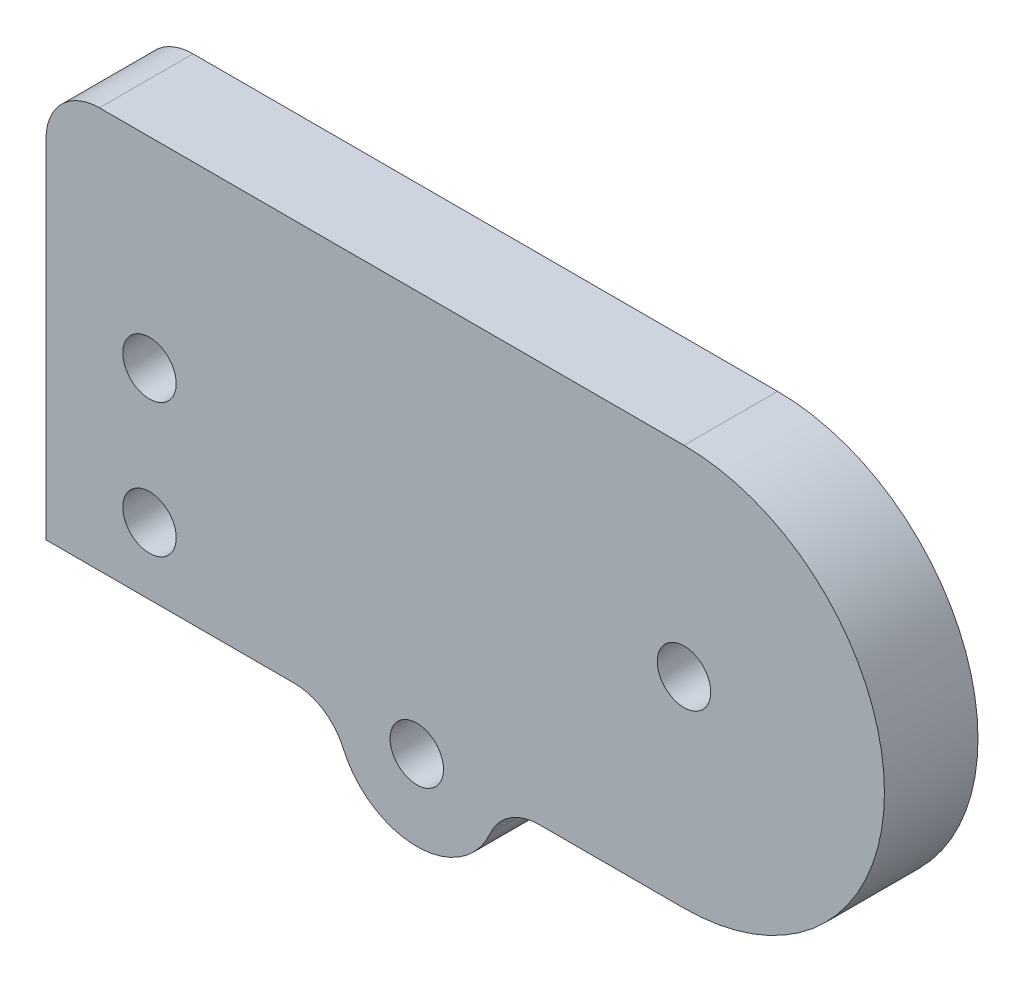
ISO-10303-21;
HEADER;
FILE_DESCRIPTION(('STEP AP214'),'2;1');
FILE_NAME('part.step','',(''),(''),'','','');
FILE_SCHEMA(('AUTOMOTIVE_DESIGN { 1 0 10303 214 1 1 1 1 }'));
ENDSEC;
DATA;
#1=APPLICATION_CONTEXT('core data for automotive mechanical design processes');
#2=APPLICATION_PROTOCOL_DEFINITION('international standard','automotive_design',2000,#1);
#3=PRODUCT_CONTEXT('',#1,'mechanical');
#4=PRODUCT('Part','Part','',(#3));
#5=PRODUCT_RELATED_PRODUCT_CATEGORY('part','',(#4));
#6=PRODUCT_DEFINITION_FORMATION('','',#4);
#7=PRODUCT_DEFINITION_CONTEXT('part definition',#1,'design');
#8=PRODUCT_DEFINITION('design','',#6,#7);
#9=PRODUCT_DEFINITION_SHAPE('','',#8);
#10=(LENGTH_UNIT() NAMED_UNIT(*) SI_UNIT(.MILLI.,.METRE.));
#11=(NAMED_UNIT(*) PLANE_ANGLE_UNIT() SI_UNIT($,.RADIAN.));
#12=(NAMED_UNIT(*) SI_UNIT($,.STERADIAN.) SOLID_ANGLE_UNIT());
#13=UNCERTAINTY_MEASURE_WITH_UNIT(LENGTH_MEASURE(1.E-05),#10,'distance_accuracy_value','');
#14=(GEOMETRIC_REPRESENTATION_CONTEXT(3) GLOBAL_UNCERTAINTY_ASSIGNED_CONTEXT((#13)) GLOBAL_UNIT_ASSIGNED_CONTEXT((#10,
#11,#12)) REPRESENTATION_CONTEXT('',''));
#15=CARTESIAN_POINT('',(0.,0.,0.));
#16=DIRECTION('',(0.,0.,1.));
#17=DIRECTION('',(1.,0.,0.));
#18=AXIS2_PLACEMENT_3D('',#15,#16,#17);
#19=CARTESIAN_POINT('',(2.,13.,3.5));
#20=DIRECTION('',(0.,0.,-1.));
#21=DIRECTION('',(-1.,0.,0.));
#22=AXIS2_PLACEMENT_3D('',#19,#20,#21);
#23=PLANE('',#22);
#24=DIRECTION('',(1.,0.,0.));
#25=VECTOR('',#24,1.);
#26=CARTESIAN_POINT('',(9.29040765125158,0.,3.5));
#27=LINE('',#26,#25);
#28=CARTESIAN_POINT('',(0.,0.,3.5));
#29=VERTEX_POINT('',#28);
#30=CARTESIAN_POINT('',(9.29040765125158,0.,3.5));
#31=VERTEX_POINT('',#30);
#32=EDGE_CURVE('E152',#29,#31,#27,.T.);
#33=ORIENTED_EDGE('',*,*,#32,.T.);
#34=CARTESIAN_POINT('',(9.29040765125158,-2.,3.5));
#35=DIRECTION('',(0.,0.,-1.));
#36=DIRECTION('',(1.,0.,0.));
#37=AXIS2_PLACEMENT_3D('',#34,#35,#36);
#38=CIRCLE('',#37,2.);
#39=CARTESIAN_POINT('',(11.1234379292339,-1.2,3.5));
#40=VERTEX_POINT('',#39);
#41=EDGE_CURVE('E95',#31,#40,#38,.T.);
#42=ORIENTED_EDGE('',*,*,#41,.T.);
#43=CARTESIAN_POINT('',(13.8729833462074,0.,3.5));
#44=DIRECTION('',(0.,0.,1.));
#45=DIRECTION('',(-1.,0.,0.));
#46=AXIS2_PLACEMENT_3D('',#43,#44,#45);
#47=CIRCLE('',#46,3.);
#48=CARTESIAN_POINT('',(16.6225287631809,-1.2,3.5));
#49=VERTEX_POINT('',#48);
#50=EDGE_CURVE('E170',#40,#49,#47,.T.);
#51=ORIENTED_EDGE('',*,*,#50,.T.);
#52=CARTESIAN_POINT('',(18.4555590411633,-2.,3.5));
#53=DIRECTION('',(0.,0.,-1.));
#54=DIRECTION('',(1.,0.,0.));
#55=AXIS2_PLACEMENT_3D('',#52,#53,#54);
#56=CIRCLE('',#55,2.);
#57=CARTESIAN_POINT('',(18.4555590411633,0.,3.5));
#58=VERTEX_POINT('',#57);
#59=EDGE_CURVE('E187',#49,#58,#56,.T.);
#60=ORIENTED_EDGE('',*,*,#59,.T.);
#61=DIRECTION('',(1.,0.,0.));
#62=VECTOR('',#61,1.);
#63=CARTESIAN_POINT('',(23.8729833462074,0.,3.5));
#64=LINE('',#63,#62);
#65=CARTESIAN_POINT('',(23.8729833462074,0.,3.5));
#66=VERTEX_POINT('',#65);
#67=EDGE_CURVE('E186',#58,#66,#64,.T.);
#68=ORIENTED_EDGE('',*,*,#67,.T.);
#69=CARTESIAN_POINT('',(23.8729833462074,7.5,3.5));
#70=DIRECTION('',(0.,0.,1.));
#71=DIRECTION('',(-1.,0.,0.));
#72=AXIS2_PLACEMENT_3D('',#69,#70,#71);
#73=CIRCLE('',#72,7.5);
#74=CARTESIAN_POINT('',(23.8729833462074,15.,3.5));
#75=VERTEX_POINT('',#74);
#76=EDGE_CURVE('E117',#66,#75,#73,.T.);
#77=ORIENTED_EDGE('',*,*,#76,.T.);
#78=DIRECTION('',(-1.,0.,0.));
#79=VECTOR('',#78,1.);
#80=CARTESIAN_POINT('',(2.00000000000001,15.,3.5));
#81=LINE('',#80,#79);
#82=CARTESIAN_POINT('',(2.00000000000001,15.,3.5));
#83=VERTEX_POINT('',#82);
#84=EDGE_CURVE('E111',#75,#83,#81,.T.);
#85=ORIENTED_EDGE('',*,*,#84,.T.);
#86=CARTESIAN_POINT('',(2.,13.,3.5));
#87=DIRECTION('',(0.,0.,1.));
#88=DIRECTION('',(-1.,0.,0.));
#89=AXIS2_PLACEMENT_3D('',#86,#87,#88);
#90=CIRCLE('',#89,2.);
#91=CARTESIAN_POINT('',(0.,13.,3.5));
#92=VERTEX_POINT('',#91);
#93=EDGE_CURVE('E115',#83,#92,#90,.T.);
#94=ORIENTED_EDGE('',*,*,#93,.T.);
#95=DIRECTION('',(0.,-1.,0.));
#96=VECTOR('',#95,1.);
#97=CARTESIAN_POINT('',(0.,0.,3.5));
#98=LINE('',#97,#96);
#99=EDGE_CURVE('E49',#92,#29,#98,.T.);
#100=ORIENTED_EDGE('',*,*,#99,.T.);
#101=EDGE_LOOP('',(#33,#42,#51,#60,#68,#77,#85,#94,#100));
#102=FACE_BOUND('',#101,.T.);
#103=CARTESIAN_POINT('',(3.87298334620742,7.5,3.5));
#104=DIRECTION('',(0.,0.,1.));
#105=DIRECTION('',(1.,0.,0.));
#106=AXIS2_PLACEMENT_3D('',#103,#104,#105);
#107=CIRCLE('',#106,0.999999999999999);
#108=CARTESIAN_POINT('',(4.87298334620742,7.5,3.5));
#109=VERTEX_POINT('',#108);
#110=EDGE_CURVE('E139',#109,#109,#107,.T.);
#111=ORIENTED_EDGE('',*,*,#110,.F.);
#112=EDGE_LOOP('',(#111));
#113=FACE_BOUND('',#112,.T.);
#114=CARTESIAN_POINT('',(23.8729833462074,7.5,3.5));
#115=DIRECTION('',(0.,0.,1.));
#116=DIRECTION('',(1.,0.,0.));
#117=AXIS2_PLACEMENT_3D('',#114,#115,#116);
#118=CIRCLE('',#117,1.);
#119=CARTESIAN_POINT('',(24.8729833462074,7.5,3.5));
#120=VERTEX_POINT('',#119);
#121=EDGE_CURVE('E197',#120,#120,#118,.T.);
#122=ORIENTED_EDGE('',*,*,#121,.F.);
#123=EDGE_LOOP('',(#122));
#124=FACE_BOUND('',#123,.T.);
#125=CARTESIAN_POINT('',(13.8729833462074,0.,3.5));
#126=DIRECTION('',(0.,0.,1.));
#127=DIRECTION('',(1.,0.,0.));
#128=AXIS2_PLACEMENT_3D('',#125,#126,#127);
#129=CIRCLE('',#128,1.);
#130=CARTESIAN_POINT('',(14.8729833462074,0.,3.5));
#131=VERTEX_POINT('',#130);
#132=EDGE_CURVE('E203',#131,#131,#129,.T.);
#133=ORIENTED_EDGE('',*,*,#132,.F.);
#134=EDGE_LOOP('',(#133));
#135=FACE_BOUND('',#134,.T.);
#136=CARTESIAN_POINT('',(3.87298334620742,2.5,3.5));
#137=DIRECTION('',(0.,0.,1.));
#138=DIRECTION('',(1.,0.,0.));
#139=AXIS2_PLACEMENT_3D('',#136,#137,#138);
#140=CIRCLE('',#139,1.);
#141=CARTESIAN_POINT('',(4.87298334620742,2.5,3.5));
#142=VERTEX_POINT('',#141);
#143=EDGE_CURVE('E209',#142,#142,#140,.T.);
#144=ORIENTED_EDGE('',*,*,#143,.F.);
#145=EDGE_LOOP('',(#144));
#146=FACE_BOUND('',#145,.T.);
#147=ADVANCED_FACE('F32',(#102,#113,#124,#135,#146),#23,.F.);
#148=CARTESIAN_POINT('',(2.,13.,0.));
#149=DIRECTION('',(0.,0.,-1.));
#150=DIRECTION('',(-1.,0.,0.));
#151=AXIS2_PLACEMENT_3D('',#148,#149,#150);
#152=PLANE('',#151);
#153=CARTESIAN_POINT('',(13.8729833462074,0.,0.));
#154=DIRECTION('',(0.,0.,1.));
#155=DIRECTION('',(1.,0.,0.));
#156=AXIS2_PLACEMENT_3D('',#153,#154,#155);
#157=CIRCLE('',#156,1.);
#158=CARTESIAN_POINT('',(14.8729833462074,0.,0.));
#159=VERTEX_POINT('',#158);
#160=EDGE_CURVE('E206',#159,#159,#157,.T.);
#161=ORIENTED_EDGE('',*,*,#160,.T.);
#162=EDGE_LOOP('',(#161));
#163=FACE_BOUND('',#162,.T.);
#164=CARTESIAN_POINT('',(3.87298334620742,7.5,0.));
#165=DIRECTION('',(0.,0.,1.));
#166=DIRECTION('',(1.,0.,0.));
#167=AXIS2_PLACEMENT_3D('',#164,#165,#166);
#168=CIRCLE('',#167,0.999999999999999);
#169=CARTESIAN_POINT('',(4.87298334620742,7.5,0.));
#170=VERTEX_POINT('',#169);
#171=EDGE_CURVE('E194',#170,#170,#168,.T.);
#172=ORIENTED_EDGE('',*,*,#171,.T.);
#173=EDGE_LOOP('',(#172));
#174=FACE_BOUND('',#173,.T.);
#175=DIRECTION('',(1.,0.,0.));
#176=VECTOR('',#175,1.);
#177=CARTESIAN_POINT('',(9.29040765125158,0.,0.));
#178=LINE('',#177,#176);
#179=CARTESIAN_POINT('',(0.,0.,0.));
#180=VERTEX_POINT('',#179);
#181=CARTESIAN_POINT('',(9.29040765125158,0.,0.));
#182=VERTEX_POINT('',#181);
#183=EDGE_CURVE('E135',#180,#182,#178,.T.);
#184=ORIENTED_EDGE('',*,*,#183,.F.);
#185=DIRECTION('',(0.,-1.,0.));
#186=VECTOR('',#185,1.);
#187=CARTESIAN_POINT('',(0.,0.,0.));
#188=LINE('',#187,#186);
#189=CARTESIAN_POINT('',(0.,13.,0.));
#190=VERTEX_POINT('',#189);
#191=EDGE_CURVE('E87',#190,#180,#188,.T.);
#192=ORIENTED_EDGE('',*,*,#191,.F.);
#193=CARTESIAN_POINT('',(2.,13.,0.));
#194=DIRECTION('',(0.,0.,1.));
#195=DIRECTION('',(-1.,0.,0.));
#196=AXIS2_PLACEMENT_3D('',#193,#194,#195);
#197=CIRCLE('',#196,2.);
#198=CARTESIAN_POINT('',(2.00000000000001,15.,0.));
#199=VERTEX_POINT('',#198);
#200=EDGE_CURVE('E81',#199,#190,#197,.T.);
#201=ORIENTED_EDGE('',*,*,#200,.F.);
#202=DIRECTION('',(-1.,0.,0.));
#203=VECTOR('',#202,1.);
#204=CARTESIAN_POINT('',(2.00000000000001,15.,0.));
#205=LINE('',#204,#203);
#206=CARTESIAN_POINT('',(23.8729833462074,15.,0.));
#207=VERTEX_POINT('',#206);
#208=EDGE_CURVE('E125',#207,#199,#205,.T.);
#209=ORIENTED_EDGE('',*,*,#208,.F.);
#210=CARTESIAN_POINT('',(23.8729833462074,7.5,0.));
#211=DIRECTION('',(0.,0.,1.));
#212=DIRECTION('',(-1.,0.,0.));
#213=AXIS2_PLACEMENT_3D('',#210,#211,#212);
#214=CIRCLE('',#213,7.5);
#215=CARTESIAN_POINT('',(23.8729833462074,0.,0.));
#216=VERTEX_POINT('',#215);
#217=EDGE_CURVE('E147',#216,#207,#214,.T.);
#218=ORIENTED_EDGE('',*,*,#217,.F.);
#219=DIRECTION('',(1.,0.,0.));
#220=VECTOR('',#219,1.);
#221=CARTESIAN_POINT('',(23.8729833462074,0.,0.));
#222=LINE('',#221,#220);
#223=CARTESIAN_POINT('',(18.4555590411633,0.,0.));
#224=VERTEX_POINT('',#223);
#225=EDGE_CURVE('E145',#224,#216,#222,.T.);
#226=ORIENTED_EDGE('',*,*,#225,.F.);
#227=CARTESIAN_POINT('',(18.4555590411633,-2.,0.));
#228=DIRECTION('',(0.,0.,-1.));
#229=DIRECTION('',(1.,0.,0.));
#230=AXIS2_PLACEMENT_3D('',#227,#228,#229);
#231=CIRCLE('',#230,2.);
#232=CARTESIAN_POINT('',(16.6225287631809,-1.2,0.));
#233=VERTEX_POINT('',#232);
#234=EDGE_CURVE('E143',#233,#224,#231,.T.);
#235=ORIENTED_EDGE('',*,*,#234,.F.);
#236=CARTESIAN_POINT('',(13.8729833462074,0.,0.));
#237=DIRECTION('',(0.,0.,1.));
#238=DIRECTION('',(-1.,0.,0.));
#239=AXIS2_PLACEMENT_3D('',#236,#237,#238);
#240=CIRCLE('',#239,3.);
#241=CARTESIAN_POINT('',(11.1234379292339,-1.2,0.));
#242=VERTEX_POINT('',#241);
#243=EDGE_CURVE('E141',#242,#233,#240,.T.);
#244=ORIENTED_EDGE('',*,*,#243,.F.);
#245=CARTESIAN_POINT('',(9.29040765125158,-2.,0.));
#246=DIRECTION('',(0.,0.,-1.));
#247=DIRECTION('',(1.,0.,0.));
#248=AXIS2_PLACEMENT_3D('',#245,#246,#247);
#249=CIRCLE('',#248,2.);
#250=EDGE_CURVE('E138',#182,#242,#249,.T.);
#251=ORIENTED_EDGE('',*,*,#250,.F.);
#252=EDGE_LOOP('',(#184,#192,#201,#209,#218,#226,#235,#244,#251));
#253=FACE_BOUND('',#252,.T.);
#254=CARTESIAN_POINT('',(23.8729833462074,7.5,0.));
#255=DIRECTION('',(0.,0.,1.));
#256=DIRECTION('',(1.,0.,0.));
#257=AXIS2_PLACEMENT_3D('',#254,#255,#256);
#258=CIRCLE('',#257,1.);
#259=CARTESIAN_POINT('',(24.8729833462074,7.5,0.));
#260=VERTEX_POINT('',#259);
#261=EDGE_CURVE('E200',#260,#260,#258,.T.);
#262=ORIENTED_EDGE('',*,*,#261,.T.);
#263=EDGE_LOOP('',(#262));
#264=FACE_BOUND('',#263,.T.);
#265=CARTESIAN_POINT('',(3.87298334620742,2.5,0.));
#266=DIRECTION('',(0.,0.,1.));
#267=DIRECTION('',(1.,0.,0.));
#268=AXIS2_PLACEMENT_3D('',#265,#266,#267);
#269=CIRCLE('',#268,1.);
#270=CARTESIAN_POINT('',(4.87298334620742,2.5,0.));
#271=VERTEX_POINT('',#270);
#272=EDGE_CURVE('E212',#271,#271,#269,.T.);
#273=ORIENTED_EDGE('',*,*,#272,.T.);
#274=EDGE_LOOP('',(#273));
#275=FACE_BOUND('',#274,.T.);
#276=ADVANCED_FACE('F174',(#163,#174,#253,#264,#275),#152,.T.);
#277=CARTESIAN_POINT('',(9.29040765125158,0.,3.5));
#278=DIRECTION('',(0.,1.,0.));
#279=DIRECTION('',(-1.,0.,0.));
#280=AXIS2_PLACEMENT_3D('',#277,#278,#279);
#281=PLANE('',#280);
#282=ORIENTED_EDGE('',*,*,#183,.T.);
#283=DIRECTION('',(0.,0.,-1.));
#284=VECTOR('',#283,1.);
#285=CARTESIAN_POINT('',(9.29040765125158,0.,3.5));
#286=LINE('',#285,#284);
#287=EDGE_CURVE('E11',#31,#182,#286,.T.);
#288=ORIENTED_EDGE('',*,*,#287,.F.);
#289=ORIENTED_EDGE('',*,*,#32,.F.);
#290=DIRECTION('',(0.,0.,-1.));
#291=VECTOR('',#290,1.);
#292=CARTESIAN_POINT('',(0.,0.,3.5));
#293=LINE('',#292,#291);
#294=EDGE_CURVE('E131',#29,#180,#293,.T.);
#295=ORIENTED_EDGE('',*,*,#294,.T.);
#296=EDGE_LOOP('',(#282,#288,#289,#295));
#297=FACE_BOUND('',#296,.T.);
#298=ADVANCED_FACE('F34',(#297),#281,.F.);
#299=CARTESIAN_POINT('',(9.29040765125158,-2.,3.5));
#300=DIRECTION('',(0.,0.,-1.));
#301=DIRECTION('',(-1.,0.,0.));
#302=AXIS2_PLACEMENT_3D('',#299,#300,#301);
#303=CYLINDRICAL_SURFACE('',#302,2.);
#304=ORIENTED_EDGE('',*,*,#250,.T.);
#305=DIRECTION('',(0.,0.,-1.));
#306=VECTOR('',#305,1.);
#307=CARTESIAN_POINT('',(11.1234379292339,-1.2,3.5));
#308=LINE('',#307,#306);
#309=EDGE_CURVE('E41',#40,#242,#308,.T.);
#310=ORIENTED_EDGE('',*,*,#309,.F.);
#311=ORIENTED_EDGE('',*,*,#41,.F.);
#312=ORIENTED_EDGE('',*,*,#287,.T.);
#313=EDGE_LOOP('',(#304,#310,#311,#312));
#314=FACE_BOUND('',#313,.T.);
#315=ADVANCED_FACE('F248',(#314),#303,.F.);
#316=CARTESIAN_POINT('',(13.8729833462074,0.,3.5));
#317=DIRECTION('',(0.,0.,-1.));
#318=DIRECTION('',(-1.,0.,0.));
#319=AXIS2_PLACEMENT_3D('',#316,#317,#318);
#320=CYLINDRICAL_SURFACE('',#319,3.);
#321=ORIENTED_EDGE('',*,*,#243,.T.);
#322=DIRECTION('',(0.,0.,-1.));
#323=VECTOR('',#322,1.);
#324=CARTESIAN_POINT('',(16.6225287631809,-1.2,3.5));
#325=LINE('',#324,#323);
#326=EDGE_CURVE('E162',#49,#233,#325,.T.);
#327=ORIENTED_EDGE('',*,*,#326,.F.);
#328=ORIENTED_EDGE('',*,*,#50,.F.);
#329=ORIENTED_EDGE('',*,*,#309,.T.);
#330=EDGE_LOOP('',(#321,#327,#328,#329));
#331=FACE_BOUND('',#330,.T.);
#332=ADVANCED_FACE('F168',(#331),#320,.T.);
#333=CARTESIAN_POINT('',(18.4555590411633,-2.,3.5));
#334=DIRECTION('',(0.,0.,-1.));
#335=DIRECTION('',(-1.,0.,0.));
#336=AXIS2_PLACEMENT_3D('',#333,#334,#335);
#337=CYLINDRICAL_SURFACE('',#336,2.);
#338=ORIENTED_EDGE('',*,*,#234,.T.);
#339=DIRECTION('',(0.,0.,-1.));
#340=VECTOR('',#339,1.);
#341=CARTESIAN_POINT('',(18.4555590411633,0.,3.5));
#342=LINE('',#341,#340);
#343=EDGE_CURVE('E159',#58,#224,#342,.T.);
#344=ORIENTED_EDGE('',*,*,#343,.F.);
#345=ORIENTED_EDGE('',*,*,#59,.F.);
#346=ORIENTED_EDGE('',*,*,#326,.T.);
#347=EDGE_LOOP('',(#338,#344,#345,#346));
#348=FACE_BOUND('',#347,.T.);
#349=ADVANCED_FACE('F180',(#348),#337,.F.);
#350=CARTESIAN_POINT('',(23.8729833462074,0.,3.5));
#351=DIRECTION('',(0.,1.,0.));
#352=DIRECTION('',(-1.,0.,0.));
#353=AXIS2_PLACEMENT_3D('',#350,#351,#352);
#354=PLANE('',#353);
#355=ORIENTED_EDGE('',*,*,#225,.T.);
#356=DIRECTION('',(0.,0.,-1.));
#357=VECTOR('',#356,1.);
#358=CARTESIAN_POINT('',(23.8729833462074,0.,3.5));
#359=LINE('',#358,#357);
#360=EDGE_CURVE('E156',#66,#216,#359,.T.);
#361=ORIENTED_EDGE('',*,*,#360,.F.);
#362=ORIENTED_EDGE('',*,*,#67,.F.);
#363=ORIENTED_EDGE('',*,*,#343,.T.);
#364=EDGE_LOOP('',(#355,#361,#362,#363));
#365=FACE_BOUND('',#364,.T.);
#366=ADVANCED_FACE('F184',(#365),#354,.F.);
#367=CARTESIAN_POINT('',(23.8729833462074,7.5,3.5));
#368=DIRECTION('',(0.,0.,-1.));
#369=DIRECTION('',(-1.,0.,0.));
#370=AXIS2_PLACEMENT_3D('',#367,#368,#369);
#371=CYLINDRICAL_SURFACE('',#370,7.5);
#372=ORIENTED_EDGE('',*,*,#217,.T.);
#373=DIRECTION('',(0.,0.,-1.));
#374=VECTOR('',#373,1.);
#375=CARTESIAN_POINT('',(23.8729833462074,15.,3.5));
#376=LINE('',#375,#374);
#377=EDGE_CURVE('E126',#75,#207,#376,.T.);
#378=ORIENTED_EDGE('',*,*,#377,.F.);
#379=ORIENTED_EDGE('',*,*,#76,.F.);
#380=ORIENTED_EDGE('',*,*,#360,.T.);
#381=EDGE_LOOP('',(#372,#378,#379,#380));
#382=FACE_BOUND('',#381,.T.);
#383=ADVANCED_FACE('F239',(#382),#371,.T.);
#384=CARTESIAN_POINT('',(2.00000000000001,15.,3.5));
#385=DIRECTION('',(0.,-1.,0.));
#386=DIRECTION('',(0.,0.,-1.));
#387=AXIS2_PLACEMENT_3D('',#384,#385,#386);
#388=PLANE('',#387);
#389=ORIENTED_EDGE('',*,*,#208,.T.);
#390=DIRECTION('',(0.,0.,-1.));
#391=VECTOR('',#390,1.);
#392=CARTESIAN_POINT('',(2.00000000000001,15.,3.5));
#393=LINE('',#392,#391);
#394=EDGE_CURVE('E122',#83,#199,#393,.T.);
#395=ORIENTED_EDGE('',*,*,#394,.F.);
#396=ORIENTED_EDGE('',*,*,#84,.F.);
#397=ORIENTED_EDGE('',*,*,#377,.T.);
#398=EDGE_LOOP('',(#389,#395,#396,#397));
#399=FACE_BOUND('',#398,.T.);
#400=ADVANCED_FACE('F123',(#399),#388,.F.);
#401=CARTESIAN_POINT('',(2.,13.,3.5));
#402=DIRECTION('',(0.,0.,-1.));
#403=DIRECTION('',(-1.,0.,0.));
#404=AXIS2_PLACEMENT_3D('',#401,#402,#403);
#405=CYLINDRICAL_SURFACE('',#404,2.);
#406=ORIENTED_EDGE('',*,*,#200,.T.);
#407=DIRECTION('',(0.,0.,-1.));
#408=VECTOR('',#407,1.);
#409=CARTESIAN_POINT('',(0.,13.,3.5));
#410=LINE('',#409,#408);
#411=EDGE_CURVE('E127',#92,#190,#410,.T.);
#412=ORIENTED_EDGE('',*,*,#411,.F.);
#413=ORIENTED_EDGE('',*,*,#93,.F.);
#414=ORIENTED_EDGE('',*,*,#394,.T.);
#415=EDGE_LOOP('',(#406,#412,#413,#414));
#416=FACE_BOUND('',#415,.T.);
#417=ADVANCED_FACE('F129',(#416),#405,.T.);
#418=CARTESIAN_POINT('',(0.,0.,3.5));
#419=DIRECTION('',(1.,0.,0.));
#420=DIRECTION('',(0.,0.,-1.));
#421=AXIS2_PLACEMENT_3D('',#418,#419,#420);
#422=PLANE('',#421);
#423=ORIENTED_EDGE('',*,*,#191,.T.);
#424=ORIENTED_EDGE('',*,*,#294,.F.);
#425=ORIENTED_EDGE('',*,*,#99,.F.);
#426=ORIENTED_EDGE('',*,*,#411,.T.);
#427=EDGE_LOOP('',(#423,#424,#425,#426));
#428=FACE_BOUND('',#427,.T.);
#429=ADVANCED_FACE('F232',(#428),#422,.F.);
#430=CARTESIAN_POINT('',(3.87298334620742,7.5,3.5));
#431=DIRECTION('',(0.,0.,-1.));
#432=DIRECTION('',(-1.,0.,0.));
#433=AXIS2_PLACEMENT_3D('',#430,#431,#432);
#434=CYLINDRICAL_SURFACE('',#433,0.999999999999999);
#435=ORIENTED_EDGE('',*,*,#110,.T.);
#436=EDGE_LOOP('',(#435));
#437=FACE_BOUND('',#436,.T.);
#438=ORIENTED_EDGE('',*,*,#171,.F.);
#439=EDGE_LOOP('',(#438));
#440=FACE_BOUND('',#439,.T.);
#441=ADVANCED_FACE('F229',(#437,#440),#434,.F.);
#442=CARTESIAN_POINT('',(23.8729833462074,7.5,3.5));
#443=DIRECTION('',(0.,0.,-1.));
#444=DIRECTION('',(-1.,0.,0.));
#445=AXIS2_PLACEMENT_3D('',#442,#443,#444);
#446=CYLINDRICAL_SURFACE('',#445,1.);
#447=ORIENTED_EDGE('',*,*,#121,.T.);
#448=EDGE_LOOP('',(#447));
#449=FACE_BOUND('',#448,.T.);
#450=ORIENTED_EDGE('',*,*,#261,.F.);
#451=EDGE_LOOP('',(#450));
#452=FACE_BOUND('',#451,.T.);
#453=ADVANCED_FACE('F317',(#449,#452),#446,.F.);
#454=CARTESIAN_POINT('',(13.8729833462074,0.,3.5));
#455=DIRECTION('',(0.,0.,-1.));
#456=DIRECTION('',(-1.,0.,0.));
#457=AXIS2_PLACEMENT_3D('',#454,#455,#456);
#458=CYLINDRICAL_SURFACE('',#457,1.);
#459=ORIENTED_EDGE('',*,*,#132,.T.);
#460=EDGE_LOOP('',(#459));
#461=FACE_BOUND('',#460,.T.);
#462=ORIENTED_EDGE('',*,*,#160,.F.);
#463=EDGE_LOOP('',(#462));
#464=FACE_BOUND('',#463,.T.);
#465=ADVANCED_FACE('F325',(#461,#464),#458,.F.);
#466=CARTESIAN_POINT('',(3.87298334620742,2.5,3.5));
#467=DIRECTION('',(0.,0.,-1.));
#468=DIRECTION('',(-1.,0.,0.));
#469=AXIS2_PLACEMENT_3D('',#466,#467,#468);
#470=CYLINDRICAL_SURFACE('',#469,1.);
#471=ORIENTED_EDGE('',*,*,#143,.T.);
#472=EDGE_LOOP('',(#471));
#473=FACE_BOUND('',#472,.T.);
#474=ORIENTED_EDGE('',*,*,#272,.F.);
#475=EDGE_LOOP('',(#474));
#476=FACE_BOUND('',#475,.T.);
#477=ADVANCED_FACE('F218',(#473,#476),#470,.F.);
#478=CLOSED_SHELL('',(#147,#276,#298,#315,#332,#349,#366,#383,#400,#417,#429,#441,#453,#465,#477));
#479=MANIFOLD_SOLID_BREP('B2',#478);
#480=ADVANCED_BREP_SHAPE_REPRESENTATION('',(#18,#479),#14);
#481=SHAPE_DEFINITION_REPRESENTATION(#9,#480);
ENDSEC;
END-ISO-10303-21;
